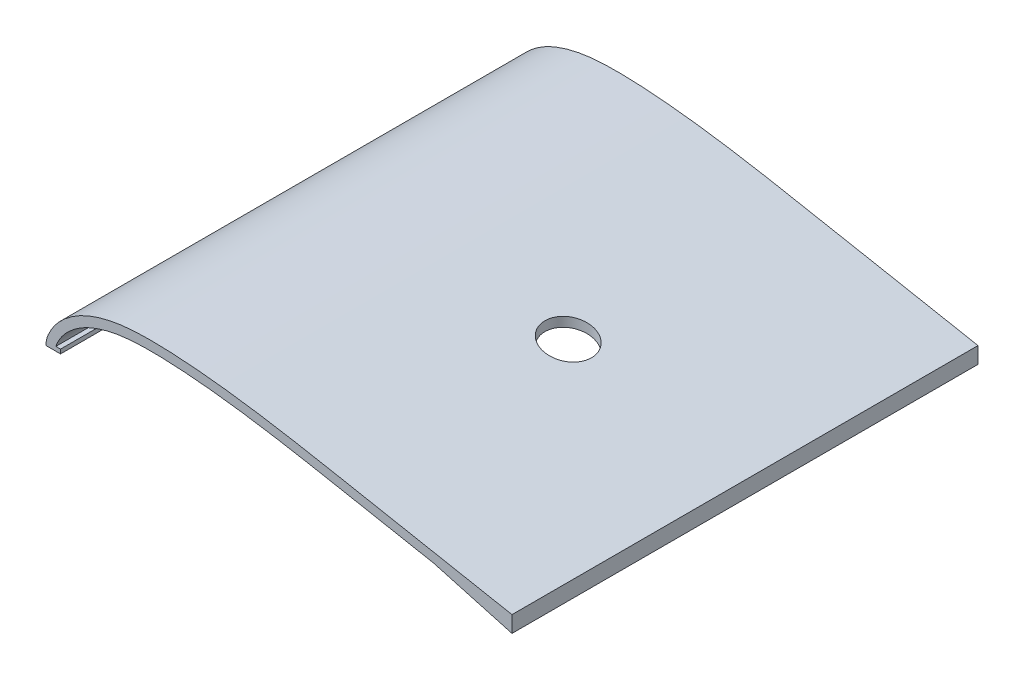
ISO-10303-21;
HEADER;
FILE_DESCRIPTION(('STEP AP214'),'2;1');
FILE_NAME('part.step','',(''),(''),'','','');
FILE_SCHEMA(('AUTOMOTIVE_DESIGN { 1 0 10303 214 1 1 1 1 }'));
ENDSEC;
DATA;
#1=APPLICATION_CONTEXT('core data for automotive mechanical design processes');
#2=APPLICATION_PROTOCOL_DEFINITION('international standard','automotive_design',2000,#1);
#3=PRODUCT_CONTEXT('',#1,'mechanical');
#4=PRODUCT('Part','Part','',(#3));
#5=PRODUCT_RELATED_PRODUCT_CATEGORY('part','',(#4));
#6=PRODUCT_DEFINITION_FORMATION('','',#4);
#7=PRODUCT_DEFINITION_CONTEXT('part definition',#1,'design');
#8=PRODUCT_DEFINITION('design','',#6,#7);
#9=PRODUCT_DEFINITION_SHAPE('','',#8);
#10=(LENGTH_UNIT() NAMED_UNIT(*) SI_UNIT(.MILLI.,.METRE.));
#11=(NAMED_UNIT(*) PLANE_ANGLE_UNIT() SI_UNIT($,.RADIAN.));
#12=(NAMED_UNIT(*) SI_UNIT($,.STERADIAN.) SOLID_ANGLE_UNIT());
#13=UNCERTAINTY_MEASURE_WITH_UNIT(LENGTH_MEASURE(1.E-05),#10,'distance_accuracy_value','');
#14=(GEOMETRIC_REPRESENTATION_CONTEXT(3) GLOBAL_UNCERTAINTY_ASSIGNED_CONTEXT((#13)) GLOBAL_UNIT_ASSIGNED_CONTEXT((#10,
#11,#12)) REPRESENTATION_CONTEXT('',''));
#15=CARTESIAN_POINT('',(0.,0.,0.));
#16=DIRECTION('',(0.,0.,1.));
#17=DIRECTION('',(1.,0.,0.));
#18=AXIS2_PLACEMENT_3D('',#15,#16,#17);
#19=CARTESIAN_POINT('',(100.,0.,10.));
#20=CARTESIAN_POINT('',(93.3331168619455,1.26557386191847,10.));
#21=CARTESIAN_POINT('',(83.333766276109,3.16885227616306,10.));
#22=CARTESIAN_POINT('',(69.9993505858364,5.69672158575541,10.));
#23=CARTESIAN_POINT('',(60.0083905950699,7.61115292207959,10.));
#24=CARTESIAN_POINT('',(50.0248149864995,9.44788699290189,10.));
#25=CARTESIAN_POINT('',(40.0304536261938,10.9742714344733,10.));
#26=CARTESIAN_POINT('',(31.6817121650036,11.8575866468183,10.));
#27=CARTESIAN_POINT('',(25.0036831808354,12.2188082758978,10.));
#28=CARTESIAN_POINT('',(19.9912972715788,12.2558988315068,10.));
#29=CARTESIAN_POINT('',(14.9320370707286,11.8315306531659,10.));
#30=CARTESIAN_POINT('',(10.5526533956863,10.7171785821723,10.));
#31=CARTESIAN_POINT('',(7.22610725751978,9.26430075591071,10.));
#32=CARTESIAN_POINT('',(4.89388660656718,7.74081065836544,10.));
#33=CARTESIAN_POINT('',(3.22821222724764,6.30238205119,10.));
#34=CARTESIAN_POINT('',(1.90562399935965,4.78389107983521,10.));
#35=CARTESIAN_POINT('',(0.674372659856759,2.85721534173638,10.));
#36=CARTESIAN_POINT('',(-0.020523104928725,1.21195926307834,10.));
#37=CARTESIAN_POINT('',(0.,0.,10.));
#38=B_SPLINE_CURVE_WITH_KNOTS('',3,(#19,#20,#21,#22,#23,#24,#25,#26,#27,#28,#29,#30,#31,#32,#33,
#34,#35,#36,#37),.UNSPECIFIED.,.F.,.F.,(4,1,1,1,1,1,1,1,1,1,1,1,1,1,1,1,4),(0.,
0.191317970003105,0.286976955004657,0.382635940006209,0.478123969117518,0.573153063374082,
0.667618396410154,0.714670745410487,0.76165960835572,0.80886449939419,0.857415615549946,
0.888332002110789,0.910749186537599,0.93572410977172,0.950117129082235,0.96737324121327,1.),.UNSPECIFIED.);
#39=DIRECTION('',(0.,0.,-1.));
#40=VECTOR('',#39,1.);
#41=SURFACE_OF_LINEAR_EXTRUSION('',#38,#40);
#42=OFFSET_SURFACE('',#41,2.,.F.);
#43=CARTESIAN_POINT('',(2.00704722763264,0.282897127086123,0.));
#44=CARTESIAN_POINT('',(2.0126242507195,0.357325599524285,0.));
#45=CARTESIAN_POINT('',(2.0212484028512,0.431474497199883,0.));
#46=CARTESIAN_POINT('',(2.04381672700371,0.578279475029767,0.));
#47=CARTESIAN_POINT('',(2.0577120924462,0.650942990932823,0.));
#48=CARTESIAN_POINT('',(2.09010576115897,0.794895593016571,0.));
#49=CARTESIAN_POINT('',(2.10858445844784,0.866189174633327,0.));
#50=CARTESIAN_POINT('',(2.14946465218734,1.00755227059699,0.));
#51=CARTESIAN_POINT('',(2.17186208169732,1.07762297196147,0.));
#52=CARTESIAN_POINT('',(2.21978124366955,1.21605894017789,0.));
#53=CARTESIAN_POINT('',(2.24527692889537,1.28443330123903,0.));
#54=CARTESIAN_POINT('',(2.29904330765903,1.42021367225229,0.));
#55=CARTESIAN_POINT('',(2.32731878060813,1.48761777764165,0.));
#56=CARTESIAN_POINT('',(2.38619566992914,1.62153092819747,0.));
#57=CARTESIAN_POINT('',(2.41680087683658,1.68803829812235,0.));
#58=CARTESIAN_POINT('',(2.47993189762873,1.82021087839164,0.));
#59=CARTESIAN_POINT('',(2.5124595667392,1.88587519827875,0.));
#60=CARTESIAN_POINT('',(2.5893349172917,2.03652754670306,0.));
#61=CARTESIAN_POINT('',(2.63423547401903,2.12123299850338,0.));
#62=CARTESIAN_POINT('',(2.70309790227971,2.2474647863474,0.));
#63=CARTESIAN_POINT('',(2.72630540185116,2.28940678619106,0.));
#64=CARTESIAN_POINT('',(2.77315901378853,2.37304512136569,0.));
#65=CARTESIAN_POINT('',(2.79680512446079,2.41474145764444,0.));
#66=CARTESIAN_POINT('',(2.86838315432661,2.53936376445514,0.));
#67=CARTESIAN_POINT('',(2.91699671212599,2.62189990176932,0.));
#68=CARTESIAN_POINT('',(3.01614806385573,2.78580272713894,0.));
#69=CARTESIAN_POINT('',(3.06668575411322,2.8671694778768,0.));
#70=CARTESIAN_POINT('',(3.16975713562201,3.02853348186229,0.));
#71=CARTESIAN_POINT('',(3.22228909560072,3.10853183930606,0.));
#72=CARTESIAN_POINT('',(3.32949649877173,3.26708142162263,0.));
#73=CARTESIAN_POINT('',(3.38417195141248,3.34563264011424,0.));
#74=CARTESIAN_POINT('',(3.49632161573062,3.50187607177887,0.));
#75=CARTESIAN_POINT('',(3.55381789519946,3.57955247342903,0.));
#76=CARTESIAN_POINT('',(3.67118326764277,3.73309067962027,0.));
#77=CARTESIAN_POINT('',(3.73105235835577,3.8089524858907,0.));
#78=CARTESIAN_POINT('',(3.85296683356255,3.95896015656184,0.));
#79=CARTESIAN_POINT('',(3.91501317169442,4.03310524482976,0.));
#80=CARTESIAN_POINT('',(4.04107585457061,4.17969820581471,0.));
#81=CARTESIAN_POINT('',(4.10509221322928,4.25214606653776,0.));
#82=CARTESIAN_POINT('',(4.2998731688626,4.46712959689421,0.));
#83=CARTESIAN_POINT('',(4.43331953548887,4.60724405090881,0.));
#84=CARTESIAN_POINT('',(4.72185440047648,4.89706852622426,0.));
#85=CARTESIAN_POINT('',(4.87767435266876,5.04604775390817,0.));
#86=CARTESIAN_POINT('',(5.19603361254105,5.33668517912126,0.));
#87=CARTESIAN_POINT('',(5.35857406095112,5.47834212451558,0.));
#88=CARTESIAN_POINT('',(5.68955995397319,5.75462844256904,0.));
#89=CARTESIAN_POINT('',(5.85800640294597,5.88925661014612,0.));
#90=CARTESIAN_POINT('',(6.11452894009671,6.08614965671369,0.));
#91=CARTESIAN_POINT('',(6.20067876363828,6.15093925631085,0.));
#92=CARTESIAN_POINT('',(6.3742066519927,6.27885357941594,0.));
#93=CARTESIAN_POINT('',(6.46158479798366,6.3419781920867,0.));
#94=CARTESIAN_POINT('',(6.90031251455326,6.65240933675206,0.));
#95=CARTESIAN_POINT('',(7.26096516344739,6.88697509430771,0.));
#96=CARTESIAN_POINT('',(7.72306539980477,7.16060796357668,0.));
#97=CARTESIAN_POINT('',(7.81604505856585,7.21435326317872,0.));
#98=CARTESIAN_POINT('',(8.00313955379291,7.31982943949469,0.));
#99=CARTESIAN_POINT('',(8.09725432779803,7.37156042639183,0.));
#100=CARTESIAN_POINT('',(8.38119025291886,7.52380024421634,0.));
#101=CARTESIAN_POINT('',(8.57260105927006,7.62135478102559,0.));
#102=CARTESIAN_POINT('',(8.95799458799,7.80868163852979,0.));
#103=CARTESIAN_POINT('',(9.15195970693545,7.8984903685514,0.));
#104=CARTESIAN_POINT('',(9.54283231076682,8.07144785505226,0.));
#105=CARTESIAN_POINT('',(9.73973982473633,8.1545965456498,0.));
#106=CARTESIAN_POINT('',(10.1362251108155,8.31488999961576,0.));
#107=CARTESIAN_POINT('',(10.3358055656362,8.39202810314144,0.));
#108=CARTESIAN_POINT('',(10.7369936478718,8.54082280274307,0.));
#109=CARTESIAN_POINT('',(10.9386012701252,8.6124794127717,0.));
#110=CARTESIAN_POINT('',(11.3436818023619,8.750514043047,0.));
#111=CARTESIAN_POINT('',(11.5471552423981,8.8168905079834,0.));
#112=CARTESIAN_POINT('',(11.9557306984676,8.94439966147388,0.));
#113=CARTESIAN_POINT('',(12.1608326977345,9.0055324039373,0.));
#114=CARTESIAN_POINT('',(12.7807317846251,9.18189128339762,0.));
#115=CARTESIAN_POINT('',(13.1977810915507,9.28928333279937,0.));
#116=CARTESIAN_POINT('',(14.0361668757041,9.48390245139569,0.));
#117=CARTESIAN_POINT('',(14.4574994611537,9.57114636851223,0.));
#118=CARTESIAN_POINT('',(15.0920051191839,9.68748781965626,0.));
#119=CARTESIAN_POINT('',(15.3038728734541,9.72384047610608,0.));
#120=CARTESIAN_POINT('',(15.7283634930346,9.79185761235897,0.));
#121=CARTESIAN_POINT('',(15.9409863717195,9.82352200869624,0.));
#122=CARTESIAN_POINT('',(16.5682453128479,9.91035542872791,0.));
#123=CARTESIAN_POINT('',(16.983733158266,9.9594277498766,0.));
#124=CARTESIAN_POINT('',(17.8161702182147,10.0431642452227,0.));
#125=CARTESIAN_POINT('',(18.233119604968,10.0778266596259,0.));
#126=CARTESIAN_POINT('',(19.0683350289152,10.1349124582422,0.));
#127=CARTESIAN_POINT('',(19.4866020420639,10.1573212447432,0.));
#128=CARTESIAN_POINT('',(20.3235253344287,10.1919814601928,0.));
#129=CARTESIAN_POINT('',(20.7421815983711,10.2042332721344,0.));
#130=CARTESIAN_POINT('',(21.5808414227442,10.2199687806833,0.));
#131=CARTESIAN_POINT('',(22.000845429827,10.2234274517074,0.));
#132=CARTESIAN_POINT('',(22.8408433183519,10.2227783771544,0.));
#133=CARTESIAN_POINT('',(23.2608371996786,10.2186705677018,0.));
#134=CARTESIAN_POINT('',(24.1017181659222,10.2041576917068,0.));
#135=CARTESIAN_POINT('',(24.5226049741106,10.1937375284086,0.));
#136=CARTESIAN_POINT('',(25.3642189787932,10.1678521287766,0.));
#137=CARTESIAN_POINT('',(25.7849461757096,10.1523869058805,0.));
#138=CARTESIAN_POINT('',(26.62666809167,10.1167447368419,0.));
#139=CARTESIAN_POINT('',(27.0476625891368,10.0965625786975,0.));
#140=CARTESIAN_POINT('',(27.8894184020099,10.051851500658,0.));
#141=CARTESIAN_POINT('',(28.3101797179334,10.027322590443,0.));
#142=CARTESIAN_POINT('',(29.1512681060358,9.97428734089227,0.));
#143=CARTESIAN_POINT('',(29.5715952872658,9.94578272336175,0.));
#144=CARTESIAN_POINT('',(30.4119860129152,9.88512429076631,0.));
#145=CARTESIAN_POINT('',(30.8320495570072,9.8529704711786,0.));
#146=CARTESIAN_POINT('',(31.6774984596377,9.78470953448053,0.));
#147=CARTESIAN_POINT('',(32.1028800191692,9.74855538164794,0.));
#148=CARTESIAN_POINT('',(32.9533363618224,9.67282015289542,0.));
#149=CARTESIAN_POINT('',(33.378411145195,9.6332390797811,0.));
#150=CARTESIAN_POINT('',(34.6513243198964,9.50978072632824,0.));
#151=CARTESIAN_POINT('',(35.4986944647979,9.42103805859805,0.));
#152=CARTESIAN_POINT('',(37.1908165968727,9.23199589631669,0.));
#153=CARTESIAN_POINT('',(38.0355706063345,9.13171435879078,0.));
#154=CARTESIAN_POINT('',(39.722959120527,8.92090725343981,0.));
#155=CARTESIAN_POINT('',(40.5655948887808,8.81039176998474,0.));
#156=CARTESIAN_POINT('',(42.2491987534027,8.58009754998197,0.));
#157=CARTESIAN_POINT('',(43.0901674412623,8.46032312595186,0.));
#158=CARTESIAN_POINT('',(44.7708671620816,8.2123244689531,0.));
#159=CARTESIAN_POINT('',(45.610598176805,8.08410011272827,0.));
#160=CARTESIAN_POINT('',(47.4906441653675,7.78835526353673,0.));
#161=CARTESIAN_POINT('',(48.530638755896,7.61879954104066,0.));
#162=CARTESIAN_POINT('',(50.6095734759533,7.2696126406257,0.));
#163=CARTESIAN_POINT('',(51.6485125886764,7.08997543683358,0.));
#164=CARTESIAN_POINT('',(53.7256038009831,6.72298344016328,0.));
#165=CARTESIAN_POINT('',(54.7637551648907,6.53562450175796,0.));
#166=CARTESIAN_POINT('',(56.839540672637,6.15554892845147,0.));
#167=CARTESIAN_POINT('',(57.8771743932518,5.96282999186869,0.));
#168=CARTESIAN_POINT('',(59.4333712060453,5.67155874937987,0.));
#169=CARTESIAN_POINT('',(59.952137715624,5.57408831711301,0.));
#170=CARTESIAN_POINT('',(60.9895729200891,5.37862815373211,0.));
#171=CARTESIAN_POINT('',(61.5082416149862,5.28063842267598,0.));
#172=CARTESIAN_POINT('',(63.0642771875683,4.98601430240126,0.));
#173=CARTESIAN_POINT('',(64.1015252358708,4.78875282134217,0.));
#174=CARTESIAN_POINT('',(66.141569812184,4.40005103505401,0.));
#175=CARTESIAN_POINT('',(67.1443707947882,4.20863405873207,0.));
#176=CARTESIAN_POINT('',(68.6485196216675,3.92165623349745,0.));
#177=CARTESIAN_POINT('',(69.1498547814867,3.82602900018857,0.));
#178=CARTESIAN_POINT('',(70.1525535423608,3.63492377858639,0.));
#179=CARTESIAN_POINT('',(70.6539171434153,3.53944579029174,0.));
#180=CARTESIAN_POINT('',(72.1577324303572,3.25325040138679,0.));
#181=CARTESIAN_POINT('',(73.1602182708183,3.06271248913815,0.));
#182=CARTESIAN_POINT('',(75.1647759206617,2.68198387106963,0.));
#183=CARTESIAN_POINT('',(76.1668477073114,2.4917930454961,0.));
#184=CARTESIAN_POINT('',(78.1703794991978,2.11155565338578,0.));
#185=CARTESIAN_POINT('',(79.1718395012596,1.92150907012412,0.));
#186=CARTESIAN_POINT('',(80.6736211377199,1.63639091615212,0.));
#187=CARTESIAN_POINT('',(81.1739543041686,1.54138009271256,0.));
#188=CARTESIAN_POINT('',(82.1746150526726,1.35132903038386,0.));
#189=CARTESIAN_POINT('',(82.6749426347279,1.2562887914946,0.));
#190=CARTESIAN_POINT('',(83.1752684663625,1.16123934514201,0.));
#191=B_SPLINE_CURVE_WITH_KNOTS('',3,(#43,#44,#45,#46,#47,#48,#49,#50,#51,#52,#53,#54,#55,#56,
#57,#58,#59,#60,#61,#62,#63,#64,#65,#66,#67,#68,#69,#70,#71,#72,#73,#74,#75,#76,#77,#78,#79,#80,
#81,#82,#83,#84,#85,#86,#87,#88,#89,#90,#91,#92,#93,#94,#95,#96,#97,#98,#99,#100,#101,#102,#103,
#104,#105,#106,#107,#108,#109,#110,#111,#112,#113,#114,#115,#116,#117,#118,#119,#120,#121,#122,
#123,#124,#125,#126,#127,#128,#129,#130,#131,#132,#133,#134,#135,#136,#137,#138,#139,#140,#141,
#142,#143,#144,#145,#146,#147,#148,#149,#150,#151,#152,#153,#154,#155,#156,#157,#158,#159,#160,
#161,#162,#163,#164,#165,#166,#167,#168,#169,#170,#171,#172,#173,#174,#175,#176,#177,#178,#179,
#180,#181,#182,#183,#184,#185,#186,#187,#188,#189,#190),.UNSPECIFIED.,.F.,.F.,(4,2,2,2,2,2,2,2,
2,2,2,2,2,2,2,2,2,2,2,2,2,2,2,2,2,2,2,2,2,2,2,2,2,2,2,2,2,2,2,2,2,2,2,2,2,2,2,2,2,2,2,2,2,2,2,2,
2,2,2,2,2,2,2,2,2,2,2,2,2,2,2,2,2,4),(0.,0.223775060905974,0.445526834872578,0.666345911019491,
0.886937161438617,1.10578780740341,1.32502154200119,1.54461993001711,1.76443381057106,
2.05200338196878,2.19580526666004,2.33960659618933,2.62694661197229,2.91427116763274,
3.20135175160611,3.48843360116378,3.77831076817234,4.06818765891211,4.35819314112508,
4.64820067213224,5.22845266017152,5.87495090899129,6.52155934790828,7.16827828604141,
7.49163898288585,7.81502115160086,9.10381539669898,9.42599287396443,9.74815270324659,
10.3924791440257,11.0335899050912,11.6747070073003,12.3165246656803,12.9583406903132,
13.6003450724495,14.2423428535149,15.5337460790988,16.8240654878767,17.4689110251438,
18.1137680413142,19.3685730780507,20.6235313115087,21.8799813340531,23.1363839769731,
24.3963584025913,25.6563434648521,26.9193538961859,28.1823609634532,29.4467702504248,
30.7111767215927,31.9750372922573,33.2388994293607,34.5196299338399,35.8003593897945,
38.3562717835371,40.9082590803591,43.4577579181449,46.0060763542157,48.5544319699388,
51.715548945311,54.8785759254212,58.0433237266818,61.2094521757057,62.7929838187006,
64.3765152850958,67.5440309371073,70.6067507816445,72.1378724424029,73.668994089268,
76.7302916103494,79.7901745713175,82.8481736765873,84.3759966380173,85.9038196060521),.UNSPECIFIED.);
#192=CARTESIAN_POINT('',(2.11855773305299,0.900000000000026,0.));
#193=VERTEX_POINT('',#192);
#194=CARTESIAN_POINT('',(83.1752684663625,1.16123934514202,0.));
#195=VERTEX_POINT('',#194);
#196=EDGE_CURVE('E90',#193,#195,#191,.T.);
#197=ORIENTED_EDGE('',*,*,#196,.F.);
#198=DIRECTION('',(0.,0.,-1.));
#199=VECTOR('',#198,1.);
#200=CARTESIAN_POINT('',(2.11855773305299,0.900000000000004,-48.37708321218));
#201=LINE('',#200,#199);
#202=CARTESIAN_POINT('',(2.11855773305299,0.900000000000026,-100.));
#203=VERTEX_POINT('',#202);
#204=EDGE_CURVE('E205',#193,#203,#201,.T.);
#205=ORIENTED_EDGE('',*,*,#204,.T.);
#206=CARTESIAN_POINT('',(2.11855811728977,0.900001379385248,-100.));
#207=CARTESIAN_POINT('',(2.13933637914277,0.974546145208498,-100.));
#208=CARTESIAN_POINT('',(2.16232680333111,1.04843483403109,-100.));
#209=CARTESIAN_POINT('',(2.21339991557062,1.19885865026702,-100.));
#210=CARTESIAN_POINT('',(2.24168917364381,1.27532399756994,-100.));
#211=CARTESIAN_POINT('',(2.30327450881236,1.43094973763202,-100.));
#212=CARTESIAN_POINT('',(2.33675755286138,1.51003524968922,-100.));
#213=CARTESIAN_POINT('',(2.40856353862447,1.67086691120363,-100.));
#214=CARTESIAN_POINT('',(2.44704673503217,1.75254109225348,-100.));
#215=CARTESIAN_POINT('',(2.52857742237133,1.9184586677308,-100.));
#216=CARTESIAN_POINT('',(2.5717552657252,2.00263761982898,-100.));
#217=CARTESIAN_POINT('',(2.66227475042147,2.17346022737373,-100.));
#218=CARTESIAN_POINT('',(2.70971590331321,2.26005071041239,-100.));
#219=CARTESIAN_POINT('',(2.85535150687075,2.51918413717477,-100.));
#220=CARTESIAN_POINT('',(2.95638174657491,2.69014827837495,-100.));
#221=CARTESIAN_POINT('',(3.16468781363463,3.02304262617745,-100.));
#222=CARTESIAN_POINT('',(3.27177726811044,3.18508884277113,-100.));
#223=CARTESIAN_POINT('',(3.49310254543571,3.4996532019465,-100.));
#224=CARTESIAN_POINT('',(3.60716292043624,3.65229418045446,-100.));
#225=CARTESIAN_POINT('',(3.8458192326343,3.95265241608437,-100.));
#226=CARTESIAN_POINT('',(3.97054220735315,4.10026842901353,-100.));
#227=CARTESIAN_POINT('',(4.23009364733956,4.39208653906799,-100.));
#228=CARTESIAN_POINT('',(4.36508277110806,4.53614483352073,-100.));
#229=CARTESIAN_POINT('',(4.64332356553287,4.81976921509921,-100.));
#230=CARTESIAN_POINT('',(4.78666041769461,4.95925154400794,-100.));
#231=CARTESIAN_POINT('',(5.08060143913547,5.2331112488201,-100.));
#232=CARTESIAN_POINT('',(5.23126046445101,5.36742963975027,-100.));
#233=CARTESIAN_POINT('',(5.5393139892753,5.63099274560215,-100.));
#234=CARTESIAN_POINT('',(5.69675714341441,5.7601804716755,-100.));
#235=CARTESIAN_POINT('',(6.01769510692624,6.01348010462549,-100.));
#236=CARTESIAN_POINT('',(6.18122797679925,6.13754369305157,-100.));
#237=CARTESIAN_POINT('',(6.51255519259714,6.37949492927005,-100.));
#238=CARTESIAN_POINT('',(6.68034519736632,6.49738852049965,-100.));
#239=CARTESIAN_POINT('',(7.01960469836729,6.72620617075521,-100.));
#240=CARTESIAN_POINT('',(7.19105604303122,6.83715711336688,-100.));
#241=CARTESIAN_POINT('',(7.53742762194419,7.05179458483526,-100.));
#242=CARTESIAN_POINT('',(7.71232965442621,7.15551044632557,-100.));
#243=CARTESIAN_POINT('',(8.06634107430763,7.35578913723564,-100.));
#244=CARTESIAN_POINT('',(8.24545328727976,7.4523469710707,-100.));
#245=CARTESIAN_POINT('',(8.60902532476378,7.6395121314037,-100.));
#246=CARTESIAN_POINT('',(8.79352076805208,7.73005005564167,-100.));
#247=CARTESIAN_POINT('',(9.16747304802449,7.90553844138337,-100.));
#248=CARTESIAN_POINT('',(9.35696146656218,7.99042140633965,-100.));
#249=CARTESIAN_POINT('',(9.74046826459209,8.15490681771302,-100.));
#250=CARTESIAN_POINT('',(9.93451303453491,8.2344475910055,-100.));
#251=CARTESIAN_POINT('',(10.3266523870076,8.38857974967389,-100.));
#252=CARTESIAN_POINT('',(10.5247678910415,8.46311759761709,-100.));
#253=CARTESIAN_POINT('',(11.1241884654115,8.6796608900962,-100.));
#254=CARTESIAN_POINT('',(11.5284047372347,8.81368286675074,-100.));
#255=CARTESIAN_POINT('',(12.3444729725232,9.06150869512486,-100.));
#256=CARTESIAN_POINT('',(12.7563465043745,9.17524104006903,-100.));
#257=CARTESIAN_POINT('',(13.5864629691059,9.38303563902299,-100.));
#258=CARTESIAN_POINT('',(14.004722453061,9.47703164606765,-100.));
#259=CARTESIAN_POINT('',(14.8463959118263,9.64576946594683,-100.));
#260=CARTESIAN_POINT('',(15.2698215769007,9.72045273668235,-100.));
#261=CARTESIAN_POINT('',(16.1223347564612,9.85176754881988,-100.));
#262=CARTESIAN_POINT('',(16.5514411978257,9.90827492999153,-100.));
#263=CARTESIAN_POINT('',(17.4151315525114,10.0055422031679,-100.));
#264=CARTESIAN_POINT('',(17.8497308635447,10.0461627357356,-100.));
#265=CARTESIAN_POINT('',(18.7236743669579,10.11363332814,-100.));
#266=CARTESIAN_POINT('',(19.1630275731738,10.1403638558035,-100.));
#267=CARTESIAN_POINT('',(20.0454375426197,10.1822484846776,-100.));
#268=CARTESIAN_POINT('',(20.4884981566968,10.1973176738958,-100.));
#269=CARTESIAN_POINT('',(21.8245623790575,10.2275389410287,-100.));
#270=CARTESIAN_POINT('',(22.7179230460684,10.2272584406102,-100.));
#271=CARTESIAN_POINT('',(24.0608114268103,10.2052140781869,-100.));
#272=CARTESIAN_POINT('',(24.5106043172741,10.1941796399065,-100.));
#273=CARTESIAN_POINT('',(25.4114132894151,10.1663246787152,-100.));
#274=CARTESIAN_POINT('',(25.8624288451972,10.1494863422437,-100.));
#275=CARTESIAN_POINT('',(27.2169977385283,10.090830953689,-100.));
#276=CARTESIAN_POINT('',(28.1202022521799,10.0409098677452,-100.));
#277=CARTESIAN_POINT('',(29.9276220825106,9.92308025739419,-100.));
#278=CARTESIAN_POINT('',(30.8318344874668,9.85512813685694,-100.));
#279=CARTESIAN_POINT('',(32.6401562413587,9.70329234343943,-100.));
#280=CARTESIAN_POINT('',(33.5442637561449,9.61938699722811,-100.));
#281=CARTESIAN_POINT('',(36.2578770596857,9.34572462172703,-100.));
#282=CARTESIAN_POINT('',(38.0652049372455,9.13425962559715,-100.));
#283=CARTESIAN_POINT('',(41.6774922580949,8.665680663593,-100.));
#284=CARTESIAN_POINT('',(43.4824396410749,8.40847580706328,-100.));
#285=CARTESIAN_POINT('',(47.0897472916989,7.85676849049518,-100.));
#286=CARTESIAN_POINT('',(48.8920978299151,7.56220288892583,-100.));
#287=CARTESIAN_POINT('',(52.4960022417375,6.94475924457703,-100.));
#288=CARTESIAN_POINT('',(54.2975454569439,6.62181977812893,-100.));
#289=CARTESIAN_POINT('',(56.9994347406765,6.12574734914318,-100.));
#290=CARTESIAN_POINT('',(57.9008371959839,5.95828375632608,-100.));
#291=CARTESIAN_POINT('',(59.7041782640571,5.62098008522329,-100.));
#292=CARTESIAN_POINT('',(60.6061164456091,5.45113769568474,-100.));
#293=CARTESIAN_POINT('',(63.3129312641579,4.93933951506565,-100.));
#294=CARTESIAN_POINT('',(65.117425821208,4.59536982997379,-100.));
#295=CARTESIAN_POINT('',(67.8247522547878,4.07884146281268,-100.));
#296=CARTESIAN_POINT('',(68.7276271101552,3.90650561856585,-100.));
#297=CARTESIAN_POINT('',(70.5336368826322,3.56228895071086,-100.));
#298=CARTESIAN_POINT('',(71.4367718169432,3.39040821724418,-100.));
#299=CARTESIAN_POINT('',(74.1459164570365,2.87529957775179,-100.));
#300=CARTESIAN_POINT('',(75.9520148616078,2.53253865180213,-100.));
#301=CARTESIAN_POINT('',(79.5638684317707,1.84712515734559,-100.));
#302=CARTESIAN_POINT('',(81.3696235958222,1.50447258072817,-100.));
#303=CARTESIAN_POINT('',(83.1752684663321,1.1612393451478,-100.));
#304=B_SPLINE_CURVE_WITH_KNOTS('',3,(#206,#207,#208,#209,#210,#211,#212,#213,#214,#215,#216,
#217,#218,#219,#220,#221,#222,#223,#224,#225,#226,#227,#228,#229,#230,#231,#232,#233,#234,#235,
#236,#237,#238,#239,#240,#241,#242,#243,#244,#245,#246,#247,#248,#249,#250,#251,#252,#253,#254,
#255,#256,#257,#258,#259,#260,#261,#262,#263,#264,#265,#266,#267,#268,#269,#270,#271,#272,#273,
#274,#275,#276,#277,#278,#279,#280,#281,#282,#283,#284,#285,#286,#287,#288,#289,#290,#291,#292,
#293,#294,#295,#296,#297,#298,#299,#300,#301,#302,#303),.UNSPECIFIED.,.F.,.F.,(4,2,2,2,2,2,2,2,
2,2,2,2,2,2,2,2,2,2,2,2,2,2,2,2,2,2,2,2,2,2,2,2,2,2,2,2,2,2,2,2,2,2,2,2,2,2,2,2,4),(0.,
0.232069971630487,0.476550243538803,0.734119237035644,1.00491711820889,1.28869206931331,
1.58487518882393,2.18040234607718,2.76282393356653,3.33412723446047,3.91357687389674,
4.50561294537819,5.10541818103703,5.7107583188043,6.32158251622847,6.93724568324512,
7.55230444535722,8.16481169406985,8.77467087376547,9.38495174341682,10.0013541067178,
10.6241335626793,11.2531746726754,11.8881273014302,13.1650666752507,14.4464210952605,
15.7320100787445,17.0214515187011,18.3195228163078,19.6287382518845,20.9490411227738,
22.2788696019664,24.9581276149893,26.307898841081,27.6618502832349,30.3753657477158,
33.0955028001777,35.8193620599278,41.2775058342376,46.7466193281298,52.2251022349571,
57.7157517937113,60.466230950868,63.2195988877664,68.7305529215312,71.4880780210053,
74.2461136052138,79.7611192990345,85.2750527099484),.UNSPECIFIED.);
#305=CARTESIAN_POINT('',(83.1752684663626,1.16123934514201,-100.));
#306=VERTEX_POINT('',#305);
#307=EDGE_CURVE('E124',#306,#203,#304,.F.);
#308=ORIENTED_EDGE('',*,*,#307,.F.);
#309=DIRECTION('',(0.,0.,-1.));
#310=VECTOR('',#309,1.);
#311=CARTESIAN_POINT('',(83.1752684663625,1.16123934514202,-50.));
#312=LINE('',#311,#310);
#313=EDGE_CURVE('E11',#306,#195,#312,.F.);
#314=ORIENTED_EDGE('',*,*,#313,.T.);
#315=EDGE_LOOP('',(#197,#205,#308,#314));
#316=FACE_BOUND('',#315,.T.);
#317=CARTESIAN_POINT('',(62.0627999145036,5.17563635545927,-54.9976990157016));
#318=CARTESIAN_POINT('',(61.7782924747062,5.22951195988148,-54.9976870226991));
#319=CARTESIAN_POINT('',(61.493568006511,5.28336383102342,-54.9733415418046));
#320=CARTESIAN_POINT('',(60.9318666767092,5.38945774012724,-54.8764686380835));
#321=CARTESIAN_POINT('',(60.6548995626628,5.44169776040329,-54.8038832012545));
#322=CARTESIAN_POINT('',(60.116864309612,5.54303148714378,-54.6123313755639));
#323=CARTESIAN_POINT('',(59.8557948701915,5.59212545097018,-54.4933687862218));
#324=CARTESIAN_POINT('',(59.3572652880194,5.68573443213652,-54.2121930776037));
#325=CARTESIAN_POINT('',(59.1197984161568,5.73025075469157,-54.0499923343985));
#326=CARTESIAN_POINT('',(58.6773950997757,5.81305287130589,-53.6882268460909));
#327=CARTESIAN_POINT('',(58.4722033650684,5.85138762834696,-53.4889857051672));
#328=CARTESIAN_POINT('',(58.098269535401,5.92114210973776,-53.0577524254353));
#329=CARTESIAN_POINT('',(57.9295257352457,5.9525621575894,-52.8257618196316));
#330=CARTESIAN_POINT('',(57.6362995800895,6.00709162018387,-52.3397699420295));
#331=CARTESIAN_POINT('',(57.5111258783504,6.03033091718366,-52.0862003640104));
#332=CARTESIAN_POINT('',(57.3051300876374,6.06854215268414,-51.5610625120711));
#333=CARTESIAN_POINT('',(57.2243038029727,6.08351487328306,-51.2894959435643));
#334=CARTESIAN_POINT('',(57.1104433892689,6.10459895012332,-50.7404098657776));
#335=CARTESIAN_POINT('',(57.0767178456143,6.11083850774941,-50.4630384975799));
#336=CARTESIAN_POINT('',(57.0558833973947,6.1146936583695,-49.9064975582658));
#337=CARTESIAN_POINT('',(57.0687719867208,6.11230971498754,-49.6273280846262));
#338=CARTESIAN_POINT('',(57.1405061172629,6.09903243333524,-49.0771141239378));
#339=CARTESIAN_POINT('',(57.199038020556,6.08819716818504,-48.8060272456486));
#340=CARTESIAN_POINT('',(57.3598578340796,6.05839308173972,-48.2776401892236));
#341=CARTESIAN_POINT('',(57.4621459496784,6.03942422226986,-48.0203400758019));
#342=CARTESIAN_POINT('',(57.7078153314554,5.9937982692721,-47.5257277526138));
#343=CARTESIAN_POINT('',(57.8513472398858,5.96711298935119,-47.2884930194002));
#344=CARTESIAN_POINT('',(58.1750511997829,5.90682728568749,-46.8415033329683));
#345=CARTESIAN_POINT('',(58.3552252722484,5.87322648051763,-46.6317498965307));
#346=CARTESIAN_POINT('',(58.7494690937414,5.79957234814444,-46.2427704800011));
#347=CARTESIAN_POINT('',(58.9639398822264,5.75944256506679,-46.0639655707722));
#348=CARTESIAN_POINT('',(59.4189086233428,5.67416838224011,-45.7448087829227));
#349=CARTESIAN_POINT('',(59.6594088169094,5.62902355072442,-45.6044602187824));
#350=CARTESIAN_POINT('',(60.1639082323715,5.53417714615616,-45.3637353629508));
#351=CARTESIAN_POINT('',(60.4282329930164,5.4844120308574,-45.2640662643338));
#352=CARTESIAN_POINT('',(60.969420188639,5.38237031889267,-45.1106089723937));
#353=CARTESIAN_POINT('',(61.2462836530201,5.33009351600046,-45.0568245533314));
#354=CARTESIAN_POINT('',(61.8087474176784,5.22375055592011,-44.9960437651749));
#355=CARTESIAN_POINT('',(62.0944154453727,5.16966969725824,-44.9896983726912));
#356=CARTESIAN_POINT('',(62.6627660742948,5.06195182500733,-45.0256643597438));
#357=CARTESIAN_POINT('',(62.9454485456979,5.00831483074117,-45.0679778464565));
#358=CARTESIAN_POINT('',(63.5011076165321,4.90278745707492,-45.2004903872905));
#359=CARTESIAN_POINT('',(63.7740347635919,4.85090603298643,-45.2909042698045));
#360=CARTESIAN_POINT('',(64.3009381612287,4.75067764021523,-45.5174130418923));
#361=CARTESIAN_POINT('',(64.5549148302614,4.70233059348851,-45.6535069224164));
#362=CARTESIAN_POINT('',(65.0346757613681,4.61096011695879,-45.9666413149352));
#363=CARTESIAN_POINT('',(65.260647308261,4.56790134141947,-46.1433843819188));
#364=CARTESIAN_POINT('',(65.6796451127847,4.48803770227929,-46.5335462635319));
#365=CARTESIAN_POINT('',(65.8726740593071,4.45123232825476,-46.7469620819452));
#366=CARTESIAN_POINT('',(66.2170206242476,4.38556374372907,-47.2008568248021));
#367=CARTESIAN_POINT('',(66.3689457534738,4.35658487103071,-47.4408580427171));
#368=CARTESIAN_POINT('',(66.6302558393692,4.30673740284365,-47.9437708834779));
#369=CARTESIAN_POINT('',(66.7396451928345,4.28586796910661,-48.2066801349478));
#370=CARTESIAN_POINT('',(66.9108859096405,4.25319745794637,-48.7431133015121));
#371=CARTESIAN_POINT('',(66.973516742563,4.24124768942268,-49.0163794744283));
#372=CARTESIAN_POINT('',(67.0522854753917,4.22621877744921,-49.5697660387979));
#373=CARTESIAN_POINT('',(67.0684267054978,4.2231389986135,-49.849885937847));
#374=CARTESIAN_POINT('',(67.0537838512083,4.2259328577448,-50.4058629058844));
#375=CARTESIAN_POINT('',(67.0234957537717,4.23171186069502,-50.6817336724692));
#376=CARTESIAN_POINT('',(66.9178658328429,4.25186560342153,-51.2243765606878));
#377=CARTESIAN_POINT('',(66.8425245268566,4.26624024446357,-51.4911487867953));
#378=CARTESIAN_POINT('',(66.649080490361,4.303145749994,-52.0082393753631));
#379=CARTESIAN_POINT('',(66.5309573114109,4.32568051477368,-52.2585498018665));
#380=CARTESIAN_POINT('',(66.2555479106682,4.37821450890956,-52.7357198794586));
#381=CARTESIAN_POINT('',(66.0982614700424,4.40821377997532,-52.9625793995003));
#382=CARTESIAN_POINT('',(65.7472274416242,4.4751512841765,-53.3891793669013));
#383=CARTESIAN_POINT('',(65.5530963836057,4.51216248792527,-53.5885926630631));
#384=CARTESIAN_POINT('',(65.1351269805713,4.59181930014,-53.9521332171501));
#385=CARTESIAN_POINT('',(64.9112788987648,4.63446675530455,-54.1162488634145));
#386=CARTESIAN_POINT('',(64.4361312719807,4.72494324864557,-54.4074972413753));
#387=CARTESIAN_POINT('',(64.184421115062,4.77284967146286,-54.5339351994145));
#388=CARTESIAN_POINT('',(63.6641221008721,4.87180146430869,-54.7426100010001));
#389=CARTESIAN_POINT('',(63.3955517898902,4.92284338398577,-54.8248944940234));
#390=CARTESIAN_POINT('',(62.9483173324268,5.00776057113301,-54.9218881262067));
#391=CARTESIAN_POINT('',(62.7724073160469,5.04114143419099,-54.9502846350944));
#392=CARTESIAN_POINT('',(62.4186264876303,5.1082300761788,-54.9881939272945));
#393=CARTESIAN_POINT('',(62.2407556555268,5.14193785845385,-54.9977065171703));
#394=CARTESIAN_POINT('',(62.0627999145036,5.17563635545927,-54.9976990157016));
#395=B_SPLINE_CURVE_WITH_KNOTS('',3,(#317,#318,#319,#320,#321,#322,#323,#324,#325,#326,#327,
#328,#329,#330,#331,#332,#333,#334,#335,#336,#337,#338,#339,#340,#341,#342,#343,#344,#345,#346,
#347,#348,#349,#350,#351,#352,#353,#354,#355,#356,#357,#358,#359,#360,#361,#362,#363,#364,#365,
#366,#367,#368,#369,#370,#371,#372,#373,#374,#375,#376,#377,#378,#379,#380,#381,#382,#383,#384,
#385,#386,#387,#388,#389,#390,#391,#392,#393,#394),.UNSPECIFIED.,.T.,.F.,(4,2,2,2,2,2,2,2,2,2,2,
2,2,2,2,2,2,2,2,2,2,2,2,2,2,2,2,2,2,2,2,2,2,2,2,2,2,2,4),(0.,0.868035599941493,1.73711700443526,
2.60612722305621,3.47488897118667,4.33638993099748,5.19785057725839,6.0449417446731,
6.89195275531617,7.72639451360734,8.56079141059359,9.38950473788589,10.2182219547588,
11.0500053825881,11.8818346998855,12.7242176008856,13.5666730824679,14.4232072721431,
15.2798119095534,16.148149998716,17.0165256927389,17.8888127367757,18.761080513668,
19.627157967438,20.4931646950545,21.3455697080143,22.1978865869749,23.0356569366448,
23.8733672726323,24.7021908250821,25.5310048573906,26.3602155616604,27.1894308994305,
28.0278035266458,28.8664515279783,29.719723100942,30.5720719799899,31.1150115116593,
31.6579566048778),.UNSPECIFIED.);
#396=CARTESIAN_POINT('',(62.0627999145036,5.17563635545927,-54.9976990157016));
#397=VERTEX_POINT('',#396);
#398=EDGE_CURVE('E217',#397,#397,#395,.T.);
#399=ORIENTED_EDGE('',*,*,#398,.T.);
#400=EDGE_LOOP('',(#399));
#401=FACE_BOUND('',#400,.T.);
#402=ADVANCED_FACE('F48',(#316,#401),#42,.T.);
#403=CARTESIAN_POINT('',(100.,0.,10.));
#404=CARTESIAN_POINT('',(93.3331168619455,1.26557386191847,10.));
#405=CARTESIAN_POINT('',(83.333766276109,3.16885227616306,10.));
#406=CARTESIAN_POINT('',(69.9993505858364,5.69672158575541,10.));
#407=CARTESIAN_POINT('',(60.0083905950699,7.61115292207959,10.));
#408=CARTESIAN_POINT('',(50.0248149864995,9.44788699290189,10.));
#409=CARTESIAN_POINT('',(40.0304536261938,10.9742714344733,10.));
#410=CARTESIAN_POINT('',(31.6817121650036,11.8575866468183,10.));
#411=CARTESIAN_POINT('',(25.0036831808354,12.2188082758978,10.));
#412=CARTESIAN_POINT('',(19.9912972715788,12.2558988315068,10.));
#413=CARTESIAN_POINT('',(14.9320370707286,11.8315306531659,10.));
#414=CARTESIAN_POINT('',(10.5526533956863,10.7171785821723,10.));
#415=CARTESIAN_POINT('',(7.22610725751978,9.26430075591071,10.));
#416=CARTESIAN_POINT('',(4.89388660656718,7.74081065836544,10.));
#417=CARTESIAN_POINT('',(3.22821222724764,6.30238205119,10.));
#418=CARTESIAN_POINT('',(1.90562399935965,4.78389107983521,10.));
#419=CARTESIAN_POINT('',(0.674372659856759,2.85721534173638,10.));
#420=CARTESIAN_POINT('',(-0.020523104928725,1.21195926307834,10.));
#421=CARTESIAN_POINT('',(0.,0.,10.));
#422=B_SPLINE_CURVE_WITH_KNOTS('',3,(#403,#404,#405,#406,#407,#408,#409,#410,#411,#412,#413,
#414,#415,#416,#417,#418,#419,#420,#421),.UNSPECIFIED.,.F.,.F.,(4,1,1,1,1,1,1,1,1,1,1,1,1,1,1,1,
4),(0.,0.191317970003105,0.286976955004657,0.382635940006209,0.478123969117518,
0.573153063374082,0.667618396410154,0.714670745410487,0.76165960835572,0.80886449939419,
0.857415615549946,0.888332002110789,0.910749186537599,0.93572410977172,0.950117129082235,
0.96737324121327,1.),.UNSPECIFIED.);
#423=DIRECTION('',(0.,0.,-1.));
#424=VECTOR('',#423,1.);
#425=SURFACE_OF_LINEAR_EXTRUSION('',#422,#424);
#426=DIRECTION('',(0.,0.,1.));
#427=VECTOR('',#426,1.);
#428=CARTESIAN_POINT('',(0.,0.,-100.));
#429=LINE('',#428,#427);
#430=CARTESIAN_POINT('',(0.,0.,-100.));
#431=VERTEX_POINT('',#430);
#432=CARTESIAN_POINT('',(0.,0.,0.));
#433=VERTEX_POINT('',#432);
#434=EDGE_CURVE('E62',#431,#433,#429,.T.);
#435=ORIENTED_EDGE('',*,*,#434,.T.);
#436=CARTESIAN_POINT('',(100.,0.,0.));
#437=CARTESIAN_POINT('',(93.3331168619455,1.26557386191847,0.));
#438=CARTESIAN_POINT('',(83.333766276109,3.16885227616306,0.));
#439=CARTESIAN_POINT('',(69.9993505858364,5.69672158575541,0.));
#440=CARTESIAN_POINT('',(60.0083905950699,7.61115292207959,0.));
#441=CARTESIAN_POINT('',(50.0248149864995,9.44788699290189,0.));
#442=CARTESIAN_POINT('',(40.0304536261938,10.9742714344733,0.));
#443=CARTESIAN_POINT('',(31.6817121650036,11.8575866468183,0.));
#444=CARTESIAN_POINT('',(25.0036831808354,12.2188082758978,0.));
#445=CARTESIAN_POINT('',(19.9912972715788,12.2558988315068,0.));
#446=CARTESIAN_POINT('',(14.9320370707286,11.8315306531659,0.));
#447=CARTESIAN_POINT('',(10.5526533956863,10.7171785821723,0.));
#448=CARTESIAN_POINT('',(7.22610725751978,9.26430075591071,0.));
#449=CARTESIAN_POINT('',(4.89388660656718,7.74081065836544,0.));
#450=CARTESIAN_POINT('',(3.22821222724764,6.30238205119,0.));
#451=CARTESIAN_POINT('',(1.90562399935965,4.78389107983521,0.));
#452=CARTESIAN_POINT('',(0.674372659856759,2.85721534173638,0.));
#453=CARTESIAN_POINT('',(-0.020523104928725,1.21195926307834,0.));
#454=CARTESIAN_POINT('',(0.,0.,0.));
#455=B_SPLINE_CURVE_WITH_KNOTS('',3,(#436,#437,#438,#439,#440,#441,#442,#443,#444,#445,#446,
#447,#448,#449,#450,#451,#452,#453,#454),.UNSPECIFIED.,.F.,.F.,(4,1,1,1,1,1,1,1,1,1,1,1,1,1,1,1,
4),(0.,0.191317970003105,0.286976955004657,0.382635940006209,0.478123969117518,
0.573153063374082,0.667618396410154,0.714670745410487,0.76165960835572,0.80886449939419,
0.857415615549946,0.888332002110789,0.910749186537599,0.93572410977172,0.950117129082235,
0.96737324121327,1.),.UNSPECIFIED.);
#456=CARTESIAN_POINT('',(100.,0.,0.));
#457=VERTEX_POINT('',#456);
#458=EDGE_CURVE('E133',#433,#457,#455,.F.);
#459=ORIENTED_EDGE('',*,*,#458,.T.);
#460=DIRECTION('',(0.,0.,1.));
#461=VECTOR('',#460,1.);
#462=CARTESIAN_POINT('',(100.,0.,-100.));
#463=LINE('',#462,#461);
#464=CARTESIAN_POINT('',(100.,0.,-100.));
#465=VERTEX_POINT('',#464);
#466=EDGE_CURVE('E119',#465,#457,#463,.T.);
#467=ORIENTED_EDGE('',*,*,#466,.F.);
#468=CARTESIAN_POINT('',(0.,0.,-100.));
#469=CARTESIAN_POINT('',(-0.020523104928725,1.21195926307834,-100.));
#470=CARTESIAN_POINT('',(0.674372659856759,2.85721534173638,-100.));
#471=CARTESIAN_POINT('',(1.90562399935965,4.78389107983521,-100.));
#472=CARTESIAN_POINT('',(3.22821222724764,6.30238205119,-100.));
#473=CARTESIAN_POINT('',(4.89388660656718,7.74081065836544,-100.));
#474=CARTESIAN_POINT('',(7.22610725751978,9.26430075591071,-100.));
#475=CARTESIAN_POINT('',(10.5526533956863,10.7171785821723,-100.));
#476=CARTESIAN_POINT('',(14.9320370707286,11.8315306531659,-100.));
#477=CARTESIAN_POINT('',(19.9912972715788,12.2558988315068,-100.));
#478=CARTESIAN_POINT('',(25.0036831808354,12.2188082758978,-100.));
#479=CARTESIAN_POINT('',(31.6817121650036,11.8575866468183,-100.));
#480=CARTESIAN_POINT('',(40.0304536261938,10.9742714344733,-100.));
#481=CARTESIAN_POINT('',(50.0248149864995,9.44788699290189,-100.));
#482=CARTESIAN_POINT('',(60.0083905950699,7.61115292207959,-100.));
#483=CARTESIAN_POINT('',(69.9993505858364,5.69672158575541,-100.));
#484=CARTESIAN_POINT('',(83.333766276109,3.16885227616306,-100.));
#485=CARTESIAN_POINT('',(93.3331168619455,1.26557386191847,-100.));
#486=CARTESIAN_POINT('',(100.,0.,-100.));
#487=B_SPLINE_CURVE_WITH_KNOTS('',3,(#468,#469,#470,#471,#472,#473,#474,#475,#476,#477,#478,
#479,#480,#481,#482,#483,#484,#485,#486),.UNSPECIFIED.,.F.,.F.,(4,1,1,1,1,1,1,1,1,1,1,1,1,1,1,1,
4),(0.,0.0326267587867305,0.0498828709177647,0.0642758902282802,0.0892508134624013,
0.111667997889211,0.142584384450054,0.19113550060581,0.23834039164428,0.285329254589513,
0.332381603589846,0.426846936625918,0.521876030882482,0.617364059993791,0.713023044995343,
0.808682029996895,1.),.UNSPECIFIED.);
#488=EDGE_CURVE('E102',#431,#465,#487,.T.);
#489=ORIENTED_EDGE('',*,*,#488,.F.);
#490=EDGE_LOOP('',(#435,#459,#467,#489));
#491=FACE_BOUND('',#490,.T.);
#492=CARTESIAN_POINT('',(62.0627999145036,7.21114210575118,-54.9976990157016));
#493=CARTESIAN_POINT('',(61.7783067949361,7.26495708673804,-54.9976870252864));
#494=CARTESIAN_POINT('',(61.4935959258932,7.31874416050575,-54.9733439938929));
#495=CARTESIAN_POINT('',(60.9319198709899,7.42470185962273,-54.8764801800343));
#496=CARTESIAN_POINT('',(60.6549644279979,7.47687045989786,-54.8039014020514));
#497=CARTESIAN_POINT('',(60.1169505737272,7.57805978204357,-54.6123669758862));
#498=CARTESIAN_POINT('',(59.8558908707991,7.62708075970005,-54.4934151016996));
#499=CARTESIAN_POINT('',(59.3573775148224,7.7205362407795,-54.2122641992863));
#500=CARTESIAN_POINT('',(59.1199171285755,7.76497205255048,-54.0500775554247));
#501=CARTESIAN_POINT('',(58.6775248561156,7.84761215954702,-53.6883446986747));
#502=CARTESIAN_POINT('',(58.4723375448961,7.88586546055488,-53.4891222630684));
#503=CARTESIAN_POINT('',(58.0984084895699,7.95546403590808,-53.0579308374587));
#504=CARTESIAN_POINT('',(57.9296650538561,7.98680963088821,-52.8259633682008));
#505=CARTESIAN_POINT('',(57.6364274618822,8.04120717774647,-52.3400107379484));
#506=CARTESIAN_POINT('',(57.5112438651943,8.06438842949915,-52.0864560696719));
#507=CARTESIAN_POINT('',(57.3052249264416,8.10250329785072,-51.5613492956331));
#508=CARTESIAN_POINT('',(57.2243854123638,8.11743769033761,-51.2897988856548));
#509=CARTESIAN_POINT('',(57.1104893016984,8.13847043059063,-50.7407204627727));
#510=CARTESIAN_POINT('',(57.0767453463799,8.14469588828599,-50.4633397444103));
#511=CARTESIAN_POINT('',(57.0558776712085,8.14854639386153,-49.9067774451974));
#512=CARTESIAN_POINT('',(57.0687514613889,8.14617190108591,-49.6275959613253));
#513=CARTESIAN_POINT('',(57.1404621727846,8.13293582016738,-49.0773415799311));
#514=CARTESIAN_POINT('',(57.1989876439917,8.12213174116897,-48.8062266121129));
#515=CARTESIAN_POINT('',(57.3598043087587,8.09240857191814,-48.2777822218758));
#516=CARTESIAN_POINT('',(57.4620957047671,8.07348944412788,-48.0204528632312));
#517=CARTESIAN_POINT('',(57.7077784941644,8.02797746573791,-47.5257902509325));
#518=CARTESIAN_POINT('',(57.8513193698234,8.00135670309422,-47.2885338614197));
#519=CARTESIAN_POINT('',(58.1750495010324,7.94120777731507,-46.8415033210688));
#520=CARTESIAN_POINT('',(58.3552407580516,7.90767923694608,-46.6317306721408));
#521=CARTESIAN_POINT('',(58.7495102717523,7.83417502670112,-46.2427338474934));
#522=CARTESIAN_POINT('',(58.9639870389959,7.79412341896614,-46.0639280588753));
#523=CARTESIAN_POINT('',(59.4189686037482,7.70899908359485,-45.7447711412979));
#524=CARTESIAN_POINT('',(59.6594756368416,7.6639259246776,-45.6044233189262));
#525=CARTESIAN_POINT('',(60.1639722498259,7.56922275252149,-45.3637099174304));
#526=CARTESIAN_POINT('',(60.4282860530588,7.51952938015364,-45.2640486988898));
#527=CARTESIAN_POINT('',(60.9694497263464,7.41762776529844,-45.11060311771));
#528=CARTESIAN_POINT('',(61.2463006237737,7.36541931668661,-45.056822522024));
#529=CARTESIAN_POINT('',(61.8087373096823,7.2592068241708,-44.9960450575641));
#530=CARTESIAN_POINT('',(62.0943908008451,7.20518798062531,-44.9896990864429));
#531=CARTESIAN_POINT('',(62.6627112604466,7.09758515178245,-45.0256586178249));
#532=CARTESIAN_POINT('',(62.9453780987289,7.04400118546013,-45.0679662318644));
#533=CARTESIAN_POINT('',(63.5010112917369,6.93856893143164,-45.2004622090325));
#534=CARTESIAN_POINT('',(63.773927979764,6.88672959197975,-45.2908663051717));
#535=CARTESIAN_POINT('',(64.300811488035,6.78657509806955,-45.5173506507518));
#536=CARTESIAN_POINT('',(64.5547787220661,6.73825986665804,-45.6534299024564));
#537=CARTESIAN_POINT('',(65.0345334743185,6.64694129524219,-45.9665367200215));
#538=CARTESIAN_POINT('',(65.2605071885376,6.60390287921385,-46.1432685722185));
#539=CARTESIAN_POINT('',(65.6795110581587,6.52407215602627,-46.5334067815667));
#540=CARTESIAN_POINT('',(65.8725438962615,6.4872793402274,-46.7468101493507));
#541=CARTESIAN_POINT('',(66.2169061157967,6.42162857559511,-47.2006865679769));
#542=CARTESIAN_POINT('',(66.368841798858,6.39265528236967,-47.440682839479));
#543=CARTESIAN_POINT('',(66.6301733603846,6.34281520118564,-47.9435873058394));
#544=CARTESIAN_POINT('',(66.7395736338243,6.32194757570853,-48.2064931301284));
#545=CARTESIAN_POINT('',(66.9108368927801,6.28927825675592,-48.7429232419551));
#546=CARTESIAN_POINT('',(66.9734790158429,6.27732797345904,-49.01618986518));
#547=CARTESIAN_POINT('',(67.0522696140049,6.26229688145019,-49.569579235147));
#548=CARTESIAN_POINT('',(67.0684214206684,6.25921543718419,-49.8497014891536));
#549=CARTESIAN_POINT('',(67.0537986035134,6.26200512885326,-50.4056835952333));
#550=CARTESIAN_POINT('',(67.023520191211,6.26778159802474,-50.6815571323715));
#551=CARTESIAN_POINT('',(66.9179087245803,6.28792898876275,-51.2242071830413));
#552=CARTESIAN_POINT('',(66.8425761874752,6.30229981166575,-51.4909838009685));
#553=CARTESIAN_POINT('',(66.64914851702,6.33919542955389,-52.0080844259161));
#554=CARTESIAN_POINT('',(66.5310329769085,6.36172411569894,-52.2584005141102));
#555=CARTESIAN_POINT('',(66.2556371987466,6.4142423529137,-52.7355833623648));
#556=CARTESIAN_POINT('',(66.0983567400155,6.44423194602303,-52.9624499902856));
#557=CARTESIAN_POINT('',(65.7473320527992,6.51114491585107,-53.38906601023));
#558=CARTESIAN_POINT('',(65.5532042417476,6.54814122288759,-53.588488189982));
#559=CARTESIAN_POINT('',(65.1352382482109,6.62776151447971,-53.9520470978258));
#560=CARTESIAN_POINT('',(64.9113903284243,6.67038734343065,-54.1161722150504));
#561=CARTESIAN_POINT('',(64.4362413563368,6.76081183310945,-54.4074382540216));
#562=CARTESIAN_POINT('',(64.1845298250202,6.80868770204603,-54.5338847291885));
#563=CARTESIAN_POINT('',(63.6642244220467,6.90756938359958,-54.7425758176006));
#564=CARTESIAN_POINT('',(63.3956491024753,6.95857175529206,-54.8248680858056));
#565=CARTESIAN_POINT('',(62.9483942664307,7.04341865236553,-54.9218748243102));
#566=CARTESIAN_POINT('',(62.7724696747285,7.07677147384999,-54.9502762565709));
#567=CARTESIAN_POINT('',(62.4186584452028,7.14380053705458,-54.988192199067));
#568=CARTESIAN_POINT('',(62.2407717873803,7.17747678207089,-54.9977065166094));
#569=CARTESIAN_POINT('',(62.0627999145036,7.21114210575118,-54.9976990157016));
#570=B_SPLINE_CURVE_WITH_KNOTS('',3,(#492,#493,#494,#495,#496,#497,#498,#499,#500,#501,#502,
#503,#504,#505,#506,#507,#508,#509,#510,#511,#512,#513,#514,#515,#516,#517,#518,#519,#520,#521,
#522,#523,#524,#525,#526,#527,#528,#529,#530,#531,#532,#533,#534,#535,#536,#537,#538,#539,#540,
#541,#542,#543,#544,#545,#546,#547,#548,#549,#550,#551,#552,#553,#554,#555,#556,#557,#558,#559,
#560,#561,#562,#563,#564,#565,#566,#567,#568,#569),.UNSPECIFIED.,.T.,.F.,(4,2,2,2,2,2,2,2,2,2,2,
2,2,2,2,2,2,2,2,2,2,2,2,2,2,2,2,2,2,2,2,2,2,2,2,2,2,2,4),(0.,0.86795954101121,1.73696455252978,
2.60589885630919,3.4745845255321,4.33600546516761,5.19738641182798,6.044437196377,
6.89140827439026,7.72588376139282,8.56031467769558,9.3891021111052,10.2178933782854,
11.0497267825137,11.8816056251848,12.7239701533684,13.5664070847262,14.4228658493364,
15.2793949253202,16.1476560803649,17.0159549188415,17.8881816925303,18.7603894143814,
19.6264426887455,20.4924253981425,21.344833119305,22.197152741954,23.0349319540338,
23.8726511281294,24.701479578188,25.5302985134443,26.3595133028932,27.188732764786,
28.0271116391112,28.8657658753589,29.7190368737815,30.5713850879188,31.1143536116278,
31.6573276748663),.UNSPECIFIED.);
#571=CARTESIAN_POINT('',(62.0627999145036,7.21114210575118,-54.9976990157016));
#572=VERTEX_POINT('',#571);
#573=EDGE_CURVE('E52',#572,#572,#570,.T.);
#574=ORIENTED_EDGE('',*,*,#573,.F.);
#575=EDGE_LOOP('',(#574));
#576=FACE_BOUND('',#575,.T.);
#577=ADVANCED_FACE('F121',(#491,#576),#425,.F.);
#578=CARTESIAN_POINT('',(0.,0.,0.));
#579=DIRECTION('',(0.,0.,-1.));
#580=DIRECTION('',(-1.,0.,0.));
#581=AXIS2_PLACEMENT_3D('',#578,#579,#580);
#582=PLANE('',#581);
#583=DIRECTION('',(1.,0.,0.));
#584=VECTOR('',#583,1.);
#585=CARTESIAN_POINT('',(0.,0.900000000000004,0.));
#586=LINE('',#585,#584);
#587=CARTESIAN_POINT('',(3.11856306666252,0.900000000000004,0.));
#588=VERTEX_POINT('',#587);
#589=EDGE_CURVE('E198',#193,#588,#586,.T.);
#590=ORIENTED_EDGE('',*,*,#589,.F.);
#591=ORIENTED_EDGE('',*,*,#196,.T.);
#592=DIRECTION('',(0.963699329807548,-0.266989890685927,0.));
#593=VECTOR('',#592,1.);
#594=CARTESIAN_POINT('',(6.22781724733036,22.4792904779915,0.));
#595=LINE('',#594,#593);
#596=CARTESIAN_POINT('',(100.,-3.5,0.));
#597=VERTEX_POINT('',#596);
#598=EDGE_CURVE('E83',#195,#597,#595,.T.);
#599=ORIENTED_EDGE('',*,*,#598,.T.);
#600=DIRECTION('',(0.,-1.,0.));
#601=VECTOR('',#600,1.);
#602=CARTESIAN_POINT('',(100.,0.,0.));
#603=LINE('',#602,#601);
#604=EDGE_CURVE('E141',#457,#597,#603,.T.);
#605=ORIENTED_EDGE('',*,*,#604,.F.);
#606=ORIENTED_EDGE('',*,*,#458,.F.);
#607=DIRECTION('',(-1.,0.,0.));
#608=VECTOR('',#607,1.);
#609=CARTESIAN_POINT('',(0.,0.,0.));
#610=LINE('',#609,#608);
#611=CARTESIAN_POINT('',(3.11856306666252,0.,0.));
#612=VERTEX_POINT('',#611);
#613=EDGE_CURVE('E116',#612,#433,#610,.T.);
#614=ORIENTED_EDGE('',*,*,#613,.F.);
#615=DIRECTION('',(0.,-1.,0.));
#616=VECTOR('',#615,1.);
#617=CARTESIAN_POINT('',(3.11856306666252,0.,0.));
#618=LINE('',#617,#616);
#619=EDGE_CURVE('E208',#588,#612,#618,.T.);
#620=ORIENTED_EDGE('',*,*,#619,.F.);
#621=EDGE_LOOP('',(#590,#591,#599,#605,#606,#614,#620));
#622=FACE_BOUND('',#621,.T.);
#623=ADVANCED_FACE('F166',(#622),#582,.F.);
#624=CARTESIAN_POINT('',(6.22781724733036,22.4792904779915,-100.));
#625=DIRECTION('',(-0.266989890685927,-0.963699329807548,0.));
#626=DIRECTION('',(0.963699329807548,-0.266989890685927,0.));
#627=AXIS2_PLACEMENT_3D('',#624,#625,#626);
#628=PLANE('',#627);
#629=ORIENTED_EDGE('',*,*,#598,.F.);
#630=ORIENTED_EDGE('',*,*,#313,.F.);
#631=DIRECTION('',(0.963699329807548,-0.266989890685927,0.));
#632=VECTOR('',#631,1.);
#633=CARTESIAN_POINT('',(6.22781724733036,22.4792904779915,-100.));
#634=LINE('',#633,#632);
#635=CARTESIAN_POINT('',(100.,-3.5,-100.));
#636=VERTEX_POINT('',#635);
#637=EDGE_CURVE('E129',#306,#636,#634,.T.);
#638=ORIENTED_EDGE('',*,*,#637,.T.);
#639=DIRECTION('',(0.,0.,1.));
#640=VECTOR('',#639,1.);
#641=CARTESIAN_POINT('',(100.,-3.5,-100.));
#642=LINE('',#641,#640);
#643=EDGE_CURVE('E126',#636,#597,#642,.T.);
#644=ORIENTED_EDGE('',*,*,#643,.T.);
#645=EDGE_LOOP('',(#629,#630,#638,#644));
#646=FACE_BOUND('',#645,.T.);
#647=ADVANCED_FACE('F169',(#646),#628,.T.);
#648=CARTESIAN_POINT('',(100.,0.,-100.));
#649=DIRECTION('',(-1.,0.,0.));
#650=DIRECTION('',(0.,0.,1.));
#651=AXIS2_PLACEMENT_3D('',#648,#649,#650);
#652=PLANE('',#651);
#653=ORIENTED_EDGE('',*,*,#604,.T.);
#654=ORIENTED_EDGE('',*,*,#643,.F.);
#655=DIRECTION('',(0.,-1.,0.));
#656=VECTOR('',#655,1.);
#657=CARTESIAN_POINT('',(100.,0.,-100.));
#658=LINE('',#657,#656);
#659=EDGE_CURVE('E71',#465,#636,#658,.T.);
#660=ORIENTED_EDGE('',*,*,#659,.F.);
#661=ORIENTED_EDGE('',*,*,#466,.T.);
#662=EDGE_LOOP('',(#653,#654,#660,#661));
#663=FACE_BOUND('',#662,.T.);
#664=ADVANCED_FACE('F163',(#663),#652,.F.);
#665=CARTESIAN_POINT('',(0.,0.,-100.));
#666=DIRECTION('',(0.,0.,-1.));
#667=DIRECTION('',(-1.,0.,0.));
#668=AXIS2_PLACEMENT_3D('',#665,#666,#667);
#669=PLANE('',#668);
#670=ORIENTED_EDGE('',*,*,#637,.F.);
#671=ORIENTED_EDGE('',*,*,#307,.T.);
#672=DIRECTION('',(-1.,0.,0.));
#673=VECTOR('',#672,1.);
#674=CARTESIAN_POINT('',(0.,0.900000000000004,-100.));
#675=LINE('',#674,#673);
#676=CARTESIAN_POINT('',(3.11856306666252,0.900000000000004,-100.));
#677=VERTEX_POINT('',#676);
#678=EDGE_CURVE('E215',#677,#203,#675,.T.);
#679=ORIENTED_EDGE('',*,*,#678,.F.);
#680=DIRECTION('',(0.,1.,0.));
#681=VECTOR('',#680,1.);
#682=CARTESIAN_POINT('',(3.11856306666252,0.,-100.));
#683=LINE('',#682,#681);
#684=CARTESIAN_POINT('',(3.11856306666252,0.,-100.));
#685=VERTEX_POINT('',#684);
#686=EDGE_CURVE('E107',#685,#677,#683,.T.);
#687=ORIENTED_EDGE('',*,*,#686,.F.);
#688=DIRECTION('',(1.,0.,0.));
#689=VECTOR('',#688,1.);
#690=CARTESIAN_POINT('',(0.,0.,-100.));
#691=LINE('',#690,#689);
#692=EDGE_CURVE('E98',#431,#685,#691,.T.);
#693=ORIENTED_EDGE('',*,*,#692,.F.);
#694=ORIENTED_EDGE('',*,*,#488,.T.);
#695=ORIENTED_EDGE('',*,*,#659,.T.);
#696=EDGE_LOOP('',(#670,#671,#679,#687,#693,#694,#695));
#697=FACE_BOUND('',#696,.T.);
#698=ADVANCED_FACE('F100',(#697),#669,.T.);
#699=CARTESIAN_POINT('',(3.11856306666252,0.,3.24583357563993));
#700=DIRECTION('',(-1.,0.,0.));
#701=DIRECTION('',(0.,0.,1.));
#702=AXIS2_PLACEMENT_3D('',#699,#700,#701);
#703=PLANE('',#702);
#704=DIRECTION('',(0.,0.,-1.));
#705=VECTOR('',#704,1.);
#706=CARTESIAN_POINT('',(3.11856306666252,0.900000000000004,3.24583357563993));
#707=LINE('',#706,#705);
#708=EDGE_CURVE('E110',#588,#677,#707,.T.);
#709=ORIENTED_EDGE('',*,*,#708,.F.);
#710=ORIENTED_EDGE('',*,*,#619,.T.);
#711=DIRECTION('',(0.,0.,-1.));
#712=VECTOR('',#711,1.);
#713=CARTESIAN_POINT('',(3.11856306666252,0.,3.24583357563993));
#714=LINE('',#713,#712);
#715=EDGE_CURVE('E209',#612,#685,#714,.T.);
#716=ORIENTED_EDGE('',*,*,#715,.T.);
#717=ORIENTED_EDGE('',*,*,#686,.T.);
#718=EDGE_LOOP('',(#709,#710,#716,#717));
#719=FACE_BOUND('',#718,.T.);
#720=ADVANCED_FACE('F162',(#719),#703,.F.);
#721=CARTESIAN_POINT('',(0.,0.,3.24583357563993));
#722=DIRECTION('',(0.,1.,0.));
#723=DIRECTION('',(-1.,0.,0.));
#724=AXIS2_PLACEMENT_3D('',#721,#722,#723);
#725=PLANE('',#724);
#726=ORIENTED_EDGE('',*,*,#715,.F.);
#727=ORIENTED_EDGE('',*,*,#613,.T.);
#728=ORIENTED_EDGE('',*,*,#434,.F.);
#729=ORIENTED_EDGE('',*,*,#692,.T.);
#730=EDGE_LOOP('',(#726,#727,#728,#729));
#731=FACE_BOUND('',#730,.T.);
#732=ADVANCED_FACE('F114',(#731),#725,.F.);
#733=CARTESIAN_POINT('',(0.,0.900000000000004,3.24583357563993));
#734=DIRECTION('',(0.,-1.,0.));
#735=DIRECTION('',(0.,0.,-1.));
#736=AXIS2_PLACEMENT_3D('',#733,#734,#735);
#737=PLANE('',#736);
#738=ORIENTED_EDGE('',*,*,#204,.F.);
#739=ORIENTED_EDGE('',*,*,#589,.T.);
#740=ORIENTED_EDGE('',*,*,#708,.T.);
#741=ORIENTED_EDGE('',*,*,#678,.T.);
#742=EDGE_LOOP('',(#738,#739,#740,#741));
#743=FACE_BOUND('',#742,.T.);
#744=ADVANCED_FACE('F237',(#743),#737,.F.);
#745=CARTESIAN_POINT('',(62.0627999145036,15.8905435756119,-49.9976990157016));
#746=DIRECTION('',(0.,-1.,0.));
#747=DIRECTION('',(0.,0.,-1.));
#748=AXIS2_PLACEMENT_3D('',#745,#746,#747);
#749=CYLINDRICAL_SURFACE('',#748,5.);
#750=ORIENTED_EDGE('',*,*,#398,.F.);
#751=EDGE_LOOP('',(#750));
#752=FACE_BOUND('',#751,.T.);
#753=ORIENTED_EDGE('',*,*,#573,.T.);
#754=EDGE_LOOP('',(#753));
#755=FACE_BOUND('',#754,.T.);
#756=ADVANCED_FACE('F233',(#752,#755),#749,.F.);
#757=CLOSED_SHELL('',(#402,#577,#623,#647,#664,#698,#720,#732,#744,#756));
#758=MANIFOLD_SOLID_BREP('B2',#757);
#759=ADVANCED_BREP_SHAPE_REPRESENTATION('',(#18,#758),#14);
#760=SHAPE_DEFINITION_REPRESENTATION(#9,#759);
ENDSEC;
END-ISO-10303-21;
